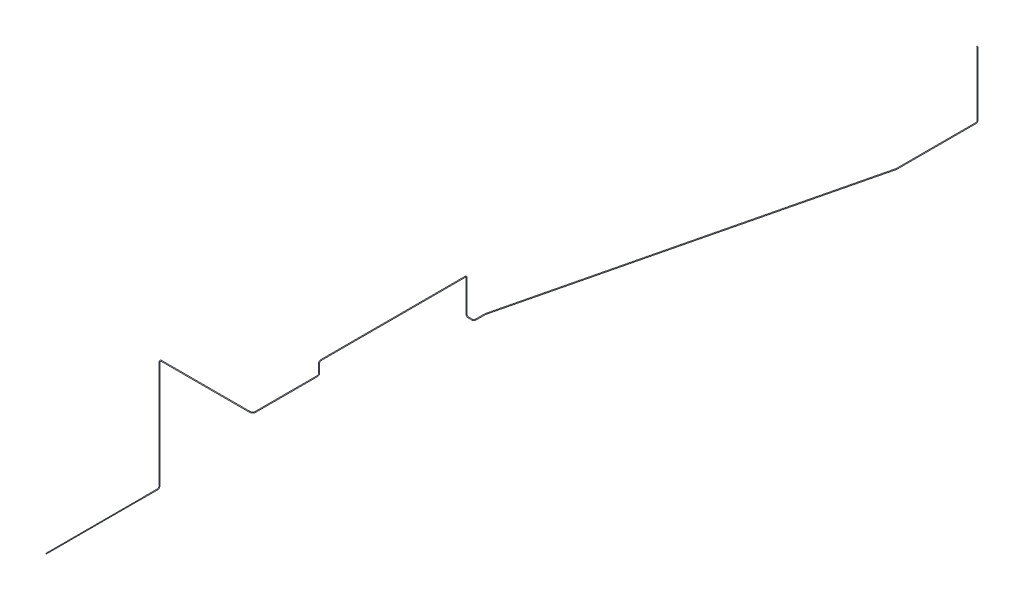
ISO-10303-21;
HEADER;
FILE_DESCRIPTION(('STEP AP214'),'2;1');
FILE_NAME('part.step','',(''),(''),'','','');
FILE_SCHEMA(('AUTOMOTIVE_DESIGN { 1 0 10303 214 1 1 1 1 }'));
ENDSEC;
DATA;
#1=APPLICATION_CONTEXT('core data for automotive mechanical design processes');
#2=APPLICATION_PROTOCOL_DEFINITION('international standard','automotive_design',2000,#1);
#3=PRODUCT_CONTEXT('',#1,'mechanical');
#4=PRODUCT('Part','Part','',(#3));
#5=PRODUCT_RELATED_PRODUCT_CATEGORY('part','',(#4));
#6=PRODUCT_DEFINITION_FORMATION('','',#4);
#7=PRODUCT_DEFINITION_CONTEXT('part definition',#1,'design');
#8=PRODUCT_DEFINITION('design','',#6,#7);
#9=PRODUCT_DEFINITION_SHAPE('','',#8);
#10=(LENGTH_UNIT() NAMED_UNIT(*) SI_UNIT(.MILLI.,.METRE.));
#11=(NAMED_UNIT(*) PLANE_ANGLE_UNIT() SI_UNIT($,.RADIAN.));
#12=(NAMED_UNIT(*) SI_UNIT($,.STERADIAN.) SOLID_ANGLE_UNIT());
#13=UNCERTAINTY_MEASURE_WITH_UNIT(LENGTH_MEASURE(1.E-05),#10,'distance_accuracy_value','');
#14=(GEOMETRIC_REPRESENTATION_CONTEXT(3) GLOBAL_UNCERTAINTY_ASSIGNED_CONTEXT((#13)) GLOBAL_UNIT_ASSIGNED_CONTEXT((#10,
#11,#12)) REPRESENTATION_CONTEXT('',''));
#15=CARTESIAN_POINT('',(0.,0.,0.));
#16=DIRECTION('',(0.,0.,1.));
#17=DIRECTION('',(1.,0.,0.));
#18=AXIS2_PLACEMENT_3D('',#15,#16,#17);
#19=CARTESIAN_POINT('',(0.,0.,-4000.));
#20=DIRECTION('',(0.,0.,1.));
#21=DIRECTION('',(1.,0.,0.));
#22=AXIS2_PLACEMENT_3D('',#19,#20,#21);
#23=CYLINDRICAL_SURFACE('',#22,12.7);
#24=CARTESIAN_POINT('',(0.,0.,-4000.));
#25=DIRECTION('',(0.,0.,-1.));
#26=DIRECTION('',(-1.,0.,0.));
#27=AXIS2_PLACEMENT_3D('',#24,#25,#26);
#28=CIRCLE('',#27,12.7);
#29=CARTESIAN_POINT('',(-12.7,0.,-4000.));
#30=VERTEX_POINT('',#29);
#31=EDGE_CURVE('E42',#30,#30,#28,.F.);
#32=ORIENTED_EDGE('',*,*,#31,.T.);
#33=EDGE_LOOP('',(#32));
#34=FACE_BOUND('',#33,.T.);
#35=CARTESIAN_POINT('',(0.,0.,0.));
#36=DIRECTION('',(0.,0.,1.));
#37=DIRECTION('',(1.,0.,0.));
#38=AXIS2_PLACEMENT_3D('',#35,#36,#37);
#39=CIRCLE('',#38,12.7);
#40=CARTESIAN_POINT('',(12.7,0.,0.));
#41=VERTEX_POINT('',#40);
#42=EDGE_CURVE('E11',#41,#41,#39,.T.);
#43=ORIENTED_EDGE('',*,*,#42,.F.);
#44=EDGE_LOOP('',(#43));
#45=FACE_BOUND('',#44,.T.);
#46=ADVANCED_FACE('F35',(#34,#45),#23,.T.);
#47=CARTESIAN_POINT('',(0.,0.,0.));
#48=DIRECTION('',(0.,0.,1.));
#49=DIRECTION('',(1.,0.,0.));
#50=AXIS2_PLACEMENT_3D('',#47,#48,#49);
#51=PLANE('',#50);
#52=ORIENTED_EDGE('',*,*,#42,.T.);
#53=EDGE_LOOP('',(#52));
#54=FACE_BOUND('',#53,.T.);
#55=ADVANCED_FACE('F146',(#54),#51,.T.);
#56=CARTESIAN_POINT('',(0.,0.,-4000.));
#57=DIRECTION('',(0.,0.,-1.));
#58=DIRECTION('',(-1.,0.,0.));
#59=AXIS2_PLACEMENT_3D('',#56,#57,#58);
#60=PLANE('',#59);
#61=ORIENTED_EDGE('',*,*,#31,.F.);
#62=EDGE_LOOP('',(#61));
#63=FACE_BOUND('',#62,.T.);
#64=CARTESIAN_POINT('',(0.,0.,-4000.));
#65=DIRECTION('',(0.,0.,-1.));
#66=DIRECTION('',(-1.,0.,0.));
#67=AXIS2_PLACEMENT_3D('',#64,#65,#66);
#68=CIRCLE('',#67,16.);
#69=CARTESIAN_POINT('',(-16.,0.,-4000.));
#70=VERTEX_POINT('',#69);
#71=EDGE_CURVE('E47',#70,#70,#68,.T.);
#72=ORIENTED_EDGE('',*,*,#71,.F.);
#73=EDGE_LOOP('',(#72));
#74=FACE_BOUND('',#73,.T.);
#75=ADVANCED_FACE('F142',(#63,#74),#60,.F.);
#76=CARTESIAN_POINT('',(4130.,3045.53474465878,-34350.));
#77=DIRECTION('',(-1.,0.,0.));
#78=DIRECTION('',(0.,-1.,0.));
#79=AXIS2_PLACEMENT_3D('',#76,#77,#78);
#80=PLANE('',#79);
#81=CARTESIAN_POINT('',(4130.,3045.53474465878,-34350.));
#82=DIRECTION('',(-1.,0.,0.));
#83=DIRECTION('',(0.,-1.,0.));
#84=AXIS2_PLACEMENT_3D('',#81,#82,#83);
#85=CIRCLE('',#84,16.);
#86=CARTESIAN_POINT('',(4130.,3029.53474465878,-34350.));
#87=VERTEX_POINT('',#86);
#88=EDGE_CURVE('E51',#87,#87,#85,.T.);
#89=ORIENTED_EDGE('',*,*,#88,.T.);
#90=EDGE_LOOP('',(#89));
#91=FACE_BOUND('',#90,.T.);
#92=ADVANCED_FACE('F52',(#91),#80,.T.);
#93=CARTESIAN_POINT('',(0.,0.,-4000.));
#94=DIRECTION('',(0.,0.,-1.));
#95=DIRECTION('',(-1.,0.,0.));
#96=AXIS2_PLACEMENT_3D('',#93,#94,#95);
#97=CYLINDRICAL_SURFACE('',#96,16.);
#98=CARTESIAN_POINT('',(0.,0.,-4590.));
#99=DIRECTION('',(0.,0.,-1.));
#100=DIRECTION('',(-1.,0.,0.));
#101=AXIS2_PLACEMENT_3D('',#98,#99,#100);
#102=CIRCLE('',#101,16.);
#103=CARTESIAN_POINT('',(0.,-15.9999999999604,-4590.));
#104=VERTEX_POINT('',#103);
#105=EDGE_CURVE('E126',#104,#104,#102,.T.);
#106=ORIENTED_EDGE('',*,*,#105,.F.);
#107=EDGE_LOOP('',(#106));
#108=FACE_BOUND('',#107,.T.);
#109=ORIENTED_EDGE('',*,*,#71,.T.);
#110=EDGE_LOOP('',(#109));
#111=FACE_BOUND('',#110,.T.);
#112=ADVANCED_FACE('F130',(#108,#111),#97,.T.);
#113=CARTESIAN_POINT('',(0.,90.,-4590.));
#114=DIRECTION('',(1.,0.,0.));
#115=DIRECTION('',(0.,0.,-1.));
#116=AXIS2_PLACEMENT_3D('',#113,#114,#115);
#117=TOROIDAL_SURFACE('',#116,89.9999999999605,16.);
#118=CARTESIAN_POINT('',(0.,89.9999999999999,-4680.));
#119=DIRECTION('',(0.,1.,0.));
#120=DIRECTION('',(-1.,0.,0.));
#121=AXIS2_PLACEMENT_3D('',#118,#119,#120);
#122=CIRCLE('',#121,16.);
#123=CARTESIAN_POINT('',(0.,89.9999999999998,-4695.99999999996));
#124=VERTEX_POINT('',#123);
#125=EDGE_CURVE('E123',#124,#124,#122,.T.);
#126=CARTESIAN_POINT('',(0.,90.,-4590.));
#127=DIRECTION('',(1.,0.,0.));
#128=DIRECTION('',(0.,0.,-1.));
#129=AXIS2_PLACEMENT_3D('',#126,#127,#128);
#130=CIRCLE('',#129,105.99999999996);
#131=EDGE_CURVE('',#104,#124,#130,.T.);
#132=ORIENTED_EDGE('',*,*,#105,.T.);
#133=ORIENTED_EDGE('',*,*,#125,.F.);
#134=ORIENTED_EDGE('',*,*,#131,.T.);
#135=ORIENTED_EDGE('',*,*,#131,.F.);
#136=EDGE_LOOP('',(#132,#134,#133,#135));
#137=FACE_BOUND('',#136,.T.);
#138=ADVANCED_FACE('F132',(#137),#117,.T.);
#139=CARTESIAN_POINT('',(0.,89.9999999999999,-4680.));
#140=DIRECTION('',(0.,1.,0.));
#141=DIRECTION('',(0.,0.,1.));
#142=AXIS2_PLACEMENT_3D('',#139,#140,#141);
#143=CYLINDRICAL_SURFACE('',#142,16.);
#144=CARTESIAN_POINT('',(0.,4510.,-4680.));
#145=DIRECTION('',(0.,1.,0.));
#146=DIRECTION('',(-1.,0.,0.));
#147=AXIS2_PLACEMENT_3D('',#144,#145,#146);
#148=CIRCLE('',#147,16.);
#149=CARTESIAN_POINT('',(-15.9999999999999,4510.,-4680.));
#150=VERTEX_POINT('',#149);
#151=EDGE_CURVE('E120',#150,#150,#148,.T.);
#152=ORIENTED_EDGE('',*,*,#151,.F.);
#153=EDGE_LOOP('',(#152));
#154=FACE_BOUND('',#153,.T.);
#155=ORIENTED_EDGE('',*,*,#125,.T.);
#156=EDGE_LOOP('',(#155));
#157=FACE_BOUND('',#156,.T.);
#158=ADVANCED_FACE('F139',(#154,#157),#143,.T.);
#159=CARTESIAN_POINT('',(90.,4510.,-4680.));
#160=DIRECTION('',(0.,0.,-1.));
#161=DIRECTION('',(-1.,0.,0.));
#162=AXIS2_PLACEMENT_3D('',#159,#160,#161);
#163=TOROIDAL_SURFACE('',#162,89.9999999999999,16.);
#164=CARTESIAN_POINT('',(89.9999999999999,4600.,-4680.));
#165=DIRECTION('',(1.,0.,0.));
#166=DIRECTION('',(0.,1.,0.));
#167=AXIS2_PLACEMENT_3D('',#164,#165,#166);
#168=CIRCLE('',#167,16.);
#169=CARTESIAN_POINT('',(89.9999999999998,4616.,-4680.));
#170=VERTEX_POINT('',#169);
#171=EDGE_CURVE('E117',#170,#170,#168,.T.);
#172=CARTESIAN_POINT('',(90.,4510.,-4680.));
#173=DIRECTION('',(0.,0.,-1.));
#174=DIRECTION('',(-1.,0.,0.));
#175=AXIS2_PLACEMENT_3D('',#172,#173,#174);
#176=CIRCLE('',#175,106.);
#177=EDGE_CURVE('',#150,#170,#176,.T.);
#178=ORIENTED_EDGE('',*,*,#151,.T.);
#179=ORIENTED_EDGE('',*,*,#171,.F.);
#180=ORIENTED_EDGE('',*,*,#177,.T.);
#181=ORIENTED_EDGE('',*,*,#177,.F.);
#182=EDGE_LOOP('',(#178,#180,#179,#181));
#183=FACE_BOUND('',#182,.T.);
#184=ADVANCED_FACE('F243',(#183),#163,.T.);
#185=CARTESIAN_POINT('',(89.9999999999999,4600.,-4680.));
#186=DIRECTION('',(1.,0.,0.));
#187=DIRECTION('',(0.,0.,-1.));
#188=AXIS2_PLACEMENT_3D('',#185,#186,#187);
#189=CYLINDRICAL_SURFACE('',#188,16.);
#190=CARTESIAN_POINT('',(3730.,4600.,-4680.));
#191=DIRECTION('',(1.,0.,0.));
#192=DIRECTION('',(0.,1.,0.));
#193=AXIS2_PLACEMENT_3D('',#190,#191,#192);
#194=CIRCLE('',#193,16.);
#195=CARTESIAN_POINT('',(3730.,4600.,-4664.));
#196=VERTEX_POINT('',#195);
#197=EDGE_CURVE('E114',#196,#196,#194,.T.);
#198=ORIENTED_EDGE('',*,*,#197,.F.);
#199=EDGE_LOOP('',(#198));
#200=FACE_BOUND('',#199,.T.);
#201=ORIENTED_EDGE('',*,*,#171,.T.);
#202=EDGE_LOOP('',(#201));
#203=FACE_BOUND('',#202,.T.);
#204=ADVANCED_FACE('F239',(#200,#203),#189,.T.);
#205=CARTESIAN_POINT('',(3730.,4600.,-4800.));
#206=DIRECTION('',(0.,1.,0.));
#207=DIRECTION('',(0.,0.,1.));
#208=AXIS2_PLACEMENT_3D('',#205,#206,#207);
#209=TOROIDAL_SURFACE('',#208,120.,16.);
#210=CARTESIAN_POINT('',(3850.,4600.,-4800.));
#211=DIRECTION('',(0.,0.,-1.));
#212=DIRECTION('',(0.,1.,0.));
#213=AXIS2_PLACEMENT_3D('',#210,#211,#212);
#214=CIRCLE('',#213,16.);
#215=CARTESIAN_POINT('',(3866.,4600.,-4800.));
#216=VERTEX_POINT('',#215);
#217=EDGE_CURVE('E111',#216,#216,#214,.T.);
#218=CARTESIAN_POINT('',(3730.,4600.,-4800.));
#219=DIRECTION('',(0.,1.,0.));
#220=DIRECTION('',(0.,0.,1.));
#221=AXIS2_PLACEMENT_3D('',#218,#219,#220);
#222=CIRCLE('',#221,136.);
#223=EDGE_CURVE('',#196,#216,#222,.T.);
#224=ORIENTED_EDGE('',*,*,#197,.T.);
#225=ORIENTED_EDGE('',*,*,#217,.F.);
#226=ORIENTED_EDGE('',*,*,#223,.T.);
#227=ORIENTED_EDGE('',*,*,#223,.F.);
#228=EDGE_LOOP('',(#224,#226,#225,#227));
#229=FACE_BOUND('',#228,.T.);
#230=ADVANCED_FACE('F235',(#229),#209,.T.);
#231=CARTESIAN_POINT('',(3850.,4600.,-4800.));
#232=DIRECTION('',(0.,0.,-1.));
#233=DIRECTION('',(-1.,0.,0.));
#234=AXIS2_PLACEMENT_3D('',#231,#232,#233);
#235=CYLINDRICAL_SURFACE('',#234,16.);
#236=CARTESIAN_POINT('',(3850.,4600.,-7370.));
#237=DIRECTION('',(0.,0.,-1.));
#238=DIRECTION('',(0.,1.,0.));
#239=AXIS2_PLACEMENT_3D('',#236,#237,#238);
#240=CIRCLE('',#239,16.);
#241=CARTESIAN_POINT('',(3850.,4584.,-7370.));
#242=VERTEX_POINT('',#241);
#243=EDGE_CURVE('E108',#242,#242,#240,.T.);
#244=ORIENTED_EDGE('',*,*,#243,.F.);
#245=EDGE_LOOP('',(#244));
#246=FACE_BOUND('',#245,.T.);
#247=ORIENTED_EDGE('',*,*,#217,.T.);
#248=EDGE_LOOP('',(#247));
#249=FACE_BOUND('',#248,.T.);
#250=ADVANCED_FACE('F231',(#246,#249),#235,.T.);
#251=CARTESIAN_POINT('',(3850.,4660.,-7370.));
#252=DIRECTION('',(1.,0.,0.));
#253=DIRECTION('',(0.,0.,-1.));
#254=AXIS2_PLACEMENT_3D('',#251,#252,#253);
#255=TOROIDAL_SURFACE('',#254,59.9999999999996,16.);
#256=CARTESIAN_POINT('',(3850.,4660.,-7430.));
#257=DIRECTION('',(0.,1.,0.));
#258=DIRECTION('',(0.,0.,1.));
#259=AXIS2_PLACEMENT_3D('',#256,#257,#258);
#260=CIRCLE('',#259,16.);
#261=CARTESIAN_POINT('',(3850.,4660.,-7446.));
#262=VERTEX_POINT('',#261);
#263=EDGE_CURVE('E105',#262,#262,#260,.T.);
#264=CARTESIAN_POINT('',(3850.,4660.,-7370.));
#265=DIRECTION('',(1.,0.,0.));
#266=DIRECTION('',(0.,0.,-1.));
#267=AXIS2_PLACEMENT_3D('',#264,#265,#266);
#268=CIRCLE('',#267,75.9999999999996);
#269=EDGE_CURVE('',#242,#262,#268,.T.);
#270=ORIENTED_EDGE('',*,*,#243,.T.);
#271=ORIENTED_EDGE('',*,*,#263,.F.);
#272=ORIENTED_EDGE('',*,*,#269,.T.);
#273=ORIENTED_EDGE('',*,*,#269,.F.);
#274=EDGE_LOOP('',(#270,#272,#271,#273));
#275=FACE_BOUND('',#274,.T.);
#276=ADVANCED_FACE('F227',(#275),#255,.T.);
#277=CARTESIAN_POINT('',(3850.,4660.,-7430.));
#278=DIRECTION('',(0.,1.,0.));
#279=DIRECTION('',(0.,0.,1.));
#280=AXIS2_PLACEMENT_3D('',#277,#278,#279);
#281=CYLINDRICAL_SURFACE('',#280,16.);
#282=CARTESIAN_POINT('',(3850.,5040.,-7430.));
#283=DIRECTION('',(0.,1.,0.));
#284=DIRECTION('',(0.,0.,1.));
#285=AXIS2_PLACEMENT_3D('',#282,#283,#284);
#286=CIRCLE('',#285,16.);
#287=CARTESIAN_POINT('',(3850.,5040.,-7414.));
#288=VERTEX_POINT('',#287);
#289=EDGE_CURVE('E102',#288,#288,#286,.T.);
#290=ORIENTED_EDGE('',*,*,#289,.F.);
#291=EDGE_LOOP('',(#290));
#292=FACE_BOUND('',#291,.T.);
#293=ORIENTED_EDGE('',*,*,#263,.T.);
#294=EDGE_LOOP('',(#293));
#295=FACE_BOUND('',#294,.T.);
#296=ADVANCED_FACE('F223',(#292,#295),#281,.T.);
#297=CARTESIAN_POINT('',(3850.,5040.,-7490.));
#298=DIRECTION('',(-1.,0.,0.));
#299=DIRECTION('',(0.,0.,1.));
#300=AXIS2_PLACEMENT_3D('',#297,#298,#299);
#301=TOROIDAL_SURFACE('',#300,59.9999999999996,16.);
#302=CARTESIAN_POINT('',(3850.,5100.,-7490.));
#303=DIRECTION('',(0.,0.,-1.));
#304=DIRECTION('',(0.,1.,0.));
#305=AXIS2_PLACEMENT_3D('',#302,#303,#304);
#306=CIRCLE('',#305,16.);
#307=CARTESIAN_POINT('',(3850.,5116.,-7490.));
#308=VERTEX_POINT('',#307);
#309=EDGE_CURVE('E99',#308,#308,#306,.T.);
#310=CARTESIAN_POINT('',(3850.,5040.,-7490.));
#311=DIRECTION('',(-1.,0.,0.));
#312=DIRECTION('',(0.,0.,1.));
#313=AXIS2_PLACEMENT_3D('',#310,#311,#312);
#314=CIRCLE('',#313,75.9999999999996);
#315=EDGE_CURVE('',#288,#308,#314,.T.);
#316=ORIENTED_EDGE('',*,*,#289,.T.);
#317=ORIENTED_EDGE('',*,*,#309,.F.);
#318=ORIENTED_EDGE('',*,*,#315,.T.);
#319=ORIENTED_EDGE('',*,*,#315,.F.);
#320=EDGE_LOOP('',(#316,#318,#317,#319));
#321=FACE_BOUND('',#320,.T.);
#322=ADVANCED_FACE('F219',(#321),#301,.T.);
#323=CARTESIAN_POINT('',(3850.,5100.,-7490.));
#324=DIRECTION('',(0.,0.,-1.));
#325=DIRECTION('',(-1.,0.,0.));
#326=AXIS2_PLACEMENT_3D('',#323,#324,#325);
#327=CYLINDRICAL_SURFACE('',#326,16.);
#328=CARTESIAN_POINT('',(3850.,5100.,-13470.));
#329=DIRECTION('',(0.,0.,-1.));
#330=DIRECTION('',(0.,1.,0.));
#331=AXIS2_PLACEMENT_3D('',#328,#329,#330);
#332=CIRCLE('',#331,16.);
#333=CARTESIAN_POINT('',(3850.,5116.,-13470.));
#334=VERTEX_POINT('',#333);
#335=EDGE_CURVE('E96',#334,#334,#332,.T.);
#336=ORIENTED_EDGE('',*,*,#335,.F.);
#337=EDGE_LOOP('',(#336));
#338=FACE_BOUND('',#337,.T.);
#339=ORIENTED_EDGE('',*,*,#309,.T.);
#340=EDGE_LOOP('',(#339));
#341=FACE_BOUND('',#340,.T.);
#342=ADVANCED_FACE('F215',(#338,#341),#327,.T.);
#343=CARTESIAN_POINT('',(3850.,5040.,-13470.));
#344=DIRECTION('',(-1.,0.,0.));
#345=DIRECTION('',(0.,0.,1.));
#346=AXIS2_PLACEMENT_3D('',#343,#344,#345);
#347=TOROIDAL_SURFACE('',#346,59.9999999999996,16.);
#348=CARTESIAN_POINT('',(3850.,5040.,-13530.));
#349=DIRECTION('',(0.,-1.,0.));
#350=DIRECTION('',(0.,0.,-1.));
#351=AXIS2_PLACEMENT_3D('',#348,#349,#350);
#352=CIRCLE('',#351,16.);
#353=CARTESIAN_POINT('',(3850.,5040.,-13546.));
#354=VERTEX_POINT('',#353);
#355=EDGE_CURVE('E93',#354,#354,#352,.T.);
#356=CARTESIAN_POINT('',(3850.,5040.,-13470.));
#357=DIRECTION('',(-1.,0.,0.));
#358=DIRECTION('',(0.,0.,1.));
#359=AXIS2_PLACEMENT_3D('',#356,#357,#358);
#360=CIRCLE('',#359,75.9999999999996);
#361=EDGE_CURVE('',#334,#354,#360,.T.);
#362=ORIENTED_EDGE('',*,*,#335,.T.);
#363=ORIENTED_EDGE('',*,*,#355,.F.);
#364=ORIENTED_EDGE('',*,*,#361,.T.);
#365=ORIENTED_EDGE('',*,*,#361,.F.);
#366=EDGE_LOOP('',(#362,#364,#363,#365));
#367=FACE_BOUND('',#366,.T.);
#368=ADVANCED_FACE('F211',(#367),#347,.T.);
#369=CARTESIAN_POINT('',(3850.,5040.,-13530.));
#370=DIRECTION('',(0.,-1.,0.));
#371=DIRECTION('',(0.,0.,-1.));
#372=AXIS2_PLACEMENT_3D('',#369,#370,#371);
#373=CYLINDRICAL_SURFACE('',#372,16.);
#374=CARTESIAN_POINT('',(3850.,3710.,-13530.));
#375=DIRECTION('',(0.,-1.,0.));
#376=DIRECTION('',(0.,0.,-1.));
#377=AXIS2_PLACEMENT_3D('',#374,#375,#376);
#378=CIRCLE('',#377,16.);
#379=CARTESIAN_POINT('',(3834.,3710.,-13530.));
#380=VERTEX_POINT('',#379);
#381=EDGE_CURVE('E90',#380,#380,#378,.T.);
#382=ORIENTED_EDGE('',*,*,#381,.F.);
#383=EDGE_LOOP('',(#382));
#384=FACE_BOUND('',#383,.T.);
#385=ORIENTED_EDGE('',*,*,#355,.T.);
#386=EDGE_LOOP('',(#385));
#387=FACE_BOUND('',#386,.T.);
#388=ADVANCED_FACE('F207',(#384,#387),#373,.T.);
#389=CARTESIAN_POINT('',(3910.,3710.,-13530.));
#390=DIRECTION('',(0.,0.,1.));
#391=DIRECTION('',(1.,0.,0.));
#392=AXIS2_PLACEMENT_3D('',#389,#390,#391);
#393=TOROIDAL_SURFACE('',#392,60.0000000000001,16.);
#394=CARTESIAN_POINT('',(3910.,3650.,-13530.));
#395=DIRECTION('',(1.,0.,0.));
#396=DIRECTION('',(0.,0.,-1.));
#397=AXIS2_PLACEMENT_3D('',#394,#395,#396);
#398=CIRCLE('',#397,16.);
#399=CARTESIAN_POINT('',(3910.,3634.,-13530.));
#400=VERTEX_POINT('',#399);
#401=EDGE_CURVE('E87',#400,#400,#398,.T.);
#402=CARTESIAN_POINT('',(3910.,3710.,-13530.));
#403=DIRECTION('',(0.,0.,1.));
#404=DIRECTION('',(1.,0.,0.));
#405=AXIS2_PLACEMENT_3D('',#402,#403,#404);
#406=CIRCLE('',#405,76.0000000000001);
#407=EDGE_CURVE('',#380,#400,#406,.T.);
#408=ORIENTED_EDGE('',*,*,#381,.T.);
#409=ORIENTED_EDGE('',*,*,#401,.F.);
#410=ORIENTED_EDGE('',*,*,#407,.T.);
#411=ORIENTED_EDGE('',*,*,#407,.F.);
#412=EDGE_LOOP('',(#408,#410,#409,#411));
#413=FACE_BOUND('',#412,.T.);
#414=ADVANCED_FACE('F203',(#413),#393,.T.);
#415=CARTESIAN_POINT('',(3910.,3650.,-13530.));
#416=DIRECTION('',(1.,0.,0.));
#417=DIRECTION('',(0.,0.,-1.));
#418=AXIS2_PLACEMENT_3D('',#415,#416,#417);
#419=CYLINDRICAL_SURFACE('',#418,16.);
#420=CARTESIAN_POINT('',(4090.,3650.,-13530.));
#421=DIRECTION('',(1.,0.,0.));
#422=DIRECTION('',(0.,0.,-1.));
#423=AXIS2_PLACEMENT_3D('',#420,#421,#422);
#424=CIRCLE('',#423,16.);
#425=CARTESIAN_POINT('',(4090.,3650.,-13514.));
#426=VERTEX_POINT('',#425);
#427=EDGE_CURVE('E84',#426,#426,#424,.T.);
#428=ORIENTED_EDGE('',*,*,#427,.F.);
#429=EDGE_LOOP('',(#428));
#430=FACE_BOUND('',#429,.T.);
#431=ORIENTED_EDGE('',*,*,#401,.T.);
#432=EDGE_LOOP('',(#431));
#433=FACE_BOUND('',#432,.T.);
#434=ADVANCED_FACE('F199',(#430,#433),#419,.T.);
#435=CARTESIAN_POINT('',(4090.,3650.,-13590.));
#436=DIRECTION('',(0.,1.,0.));
#437=DIRECTION('',(0.,0.,1.));
#438=AXIS2_PLACEMENT_3D('',#435,#436,#437);
#439=TOROIDAL_SURFACE('',#438,60.0000000000005,16.);
#440=CARTESIAN_POINT('',(4150.,3650.,-13590.));
#441=DIRECTION('',(0.,0.,-1.));
#442=DIRECTION('',(-1.,0.,0.));
#443=AXIS2_PLACEMENT_3D('',#440,#441,#442);
#444=CIRCLE('',#443,16.);
#445=CARTESIAN_POINT('',(4166.,3650.,-13590.));
#446=VERTEX_POINT('',#445);
#447=EDGE_CURVE('E81',#446,#446,#444,.T.);
#448=CARTESIAN_POINT('',(4090.,3650.,-13590.));
#449=DIRECTION('',(0.,1.,0.));
#450=DIRECTION('',(0.,0.,1.));
#451=AXIS2_PLACEMENT_3D('',#448,#449,#450);
#452=CIRCLE('',#451,76.0000000000005);
#453=EDGE_CURVE('',#426,#446,#452,.T.);
#454=ORIENTED_EDGE('',*,*,#427,.T.);
#455=ORIENTED_EDGE('',*,*,#447,.F.);
#456=ORIENTED_EDGE('',*,*,#453,.T.);
#457=ORIENTED_EDGE('',*,*,#453,.F.);
#458=EDGE_LOOP('',(#454,#456,#455,#457));
#459=FACE_BOUND('',#458,.T.);
#460=ADVANCED_FACE('F195',(#459),#439,.T.);
#461=CARTESIAN_POINT('',(4150.,3650.,-13590.));
#462=DIRECTION('',(0.,0.,-1.));
#463=DIRECTION('',(-1.,0.,0.));
#464=AXIS2_PLACEMENT_3D('',#461,#462,#463);
#465=CYLINDRICAL_SURFACE('',#464,16.);
#466=CARTESIAN_POINT('',(4150.,3650.,-13994.2226571081));
#467=DIRECTION('',(0.,0.,-1.));
#468=DIRECTION('',(-1.,0.,0.));
#469=AXIS2_PLACEMENT_3D('',#466,#467,#468);
#470=CIRCLE('',#469,16.);
#471=CARTESIAN_POINT('',(4150.,3666.,-13994.2226571081));
#472=VERTEX_POINT('',#471);
#473=EDGE_CURVE('E78',#472,#472,#470,.T.);
#474=ORIENTED_EDGE('',*,*,#473,.F.);
#475=EDGE_LOOP('',(#474));
#476=FACE_BOUND('',#475,.T.);
#477=ORIENTED_EDGE('',*,*,#447,.T.);
#478=EDGE_LOOP('',(#477));
#479=FACE_BOUND('',#478,.T.);
#480=ADVANCED_FACE('F191',(#476,#479),#465,.T.);
#481=CARTESIAN_POINT('',(4150.,3590.,-13994.2226571081));
#482=DIRECTION('',(-1.,0.,0.));
#483=DIRECTION('',(0.,0.,1.));
#484=AXIS2_PLACEMENT_3D('',#481,#482,#483);
#485=TOROIDAL_SURFACE('',#484,59.9999999999996,16.);
#486=CARTESIAN_POINT('',(4150.,3648.89763100686,-14005.6711968307));
#487=DIRECTION('',(0.,-0.190808995376558,-0.981627183447661));
#488=DIRECTION('',(-1.,0.,0.));
#489=AXIS2_PLACEMENT_3D('',#486,#487,#488);
#490=CIRCLE('',#489,16.);
#491=CARTESIAN_POINT('',(4150.,3664.60366594202,-14008.7241407568));
#492=VERTEX_POINT('',#491);
#493=EDGE_CURVE('E75',#492,#492,#490,.T.);
#494=CARTESIAN_POINT('',(4150.,3590.,-13994.2226571081));
#495=DIRECTION('',(-1.,0.,0.));
#496=DIRECTION('',(0.,0.,1.));
#497=AXIS2_PLACEMENT_3D('',#494,#495,#496);
#498=CIRCLE('',#497,75.9999999999996);
#499=EDGE_CURVE('',#472,#492,#498,.T.);
#500=ORIENTED_EDGE('',*,*,#473,.T.);
#501=ORIENTED_EDGE('',*,*,#493,.F.);
#502=ORIENTED_EDGE('',*,*,#499,.T.);
#503=ORIENTED_EDGE('',*,*,#499,.F.);
#504=EDGE_LOOP('',(#500,#502,#501,#503));
#505=FACE_BOUND('',#504,.T.);
#506=ADVANCED_FACE('F187',(#505),#485,.T.);
#507=CARTESIAN_POINT('',(4150.,3648.89763100686,-14005.6711968307));
#508=DIRECTION('',(0.,-0.190808995376545,-0.981627183447664));
#509=DIRECTION('',(0.,0.981627183447664,-0.190808995376545));
#510=AXIS2_PLACEMENT_3D('',#507,#508,#509);
#511=CYLINDRICAL_SURFACE('',#510,16.);
#512=CARTESIAN_POINT('',(4150.,346.637113651918,-30994.3288031693));
#513=DIRECTION('',(0.,-0.190808995376545,-0.981627183447664));
#514=DIRECTION('',(-1.,0.,0.));
#515=AXIS2_PLACEMENT_3D('',#512,#513,#514);
#516=CIRCLE('',#515,16.);
#517=CARTESIAN_POINT('',(4150.,330.931078716755,-30991.2758592432));
#518=VERTEX_POINT('',#517);
#519=EDGE_CURVE('E72',#518,#518,#516,.T.);
#520=ORIENTED_EDGE('',*,*,#519,.F.);
#521=EDGE_LOOP('',(#520));
#522=FACE_BOUND('',#521,.T.);
#523=ORIENTED_EDGE('',*,*,#493,.T.);
#524=EDGE_LOOP('',(#523));
#525=FACE_BOUND('',#524,.T.);
#526=ADVANCED_FACE('F183',(#522,#525),#511,.T.);
#527=CARTESIAN_POINT('',(4150.,405.534744658777,-31005.7773428919));
#528=DIRECTION('',(1.,0.,0.));
#529=DIRECTION('',(0.,0.,-1.));
#530=AXIS2_PLACEMENT_3D('',#527,#528,#529);
#531=TOROIDAL_SURFACE('',#530,59.9999999999999,16.);
#532=CARTESIAN_POINT('',(4150.,345.534744658777,-31005.7773428919));
#533=DIRECTION('',(0.,0.,-1.));
#534=DIRECTION('',(-1.,0.,0.));
#535=AXIS2_PLACEMENT_3D('',#532,#533,#534);
#536=CIRCLE('',#535,16.);
#537=CARTESIAN_POINT('',(4150.,329.534744658777,-31005.7773428919));
#538=VERTEX_POINT('',#537);
#539=EDGE_CURVE('E69',#538,#538,#536,.T.);
#540=CARTESIAN_POINT('',(4150.,405.534744658777,-31005.7773428919));
#541=DIRECTION('',(1.,0.,0.));
#542=DIRECTION('',(0.,0.,-1.));
#543=AXIS2_PLACEMENT_3D('',#540,#541,#542);
#544=CIRCLE('',#543,75.9999999999999);
#545=EDGE_CURVE('',#518,#538,#544,.T.);
#546=ORIENTED_EDGE('',*,*,#519,.T.);
#547=ORIENTED_EDGE('',*,*,#539,.F.);
#548=ORIENTED_EDGE('',*,*,#545,.T.);
#549=ORIENTED_EDGE('',*,*,#545,.F.);
#550=EDGE_LOOP('',(#546,#548,#547,#549));
#551=FACE_BOUND('',#550,.T.);
#552=ADVANCED_FACE('F179',(#551),#531,.T.);
#553=CARTESIAN_POINT('',(4150.,345.534744658777,-31005.7773428919));
#554=DIRECTION('',(0.,0.,-1.));
#555=DIRECTION('',(-1.,0.,0.));
#556=AXIS2_PLACEMENT_3D('',#553,#554,#555);
#557=CYLINDRICAL_SURFACE('',#556,16.);
#558=CARTESIAN_POINT('',(4150.,345.534744658777,-34290.));
#559=DIRECTION('',(0.,0.,-1.));
#560=DIRECTION('',(-1.,0.,0.));
#561=AXIS2_PLACEMENT_3D('',#558,#559,#560);
#562=CIRCLE('',#561,16.);
#563=CARTESIAN_POINT('',(4150.,329.534744658776,-34290.));
#564=VERTEX_POINT('',#563);
#565=EDGE_CURVE('E66',#564,#564,#562,.T.);
#566=ORIENTED_EDGE('',*,*,#565,.F.);
#567=EDGE_LOOP('',(#566));
#568=FACE_BOUND('',#567,.T.);
#569=ORIENTED_EDGE('',*,*,#539,.T.);
#570=EDGE_LOOP('',(#569));
#571=FACE_BOUND('',#570,.T.);
#572=ADVANCED_FACE('F175',(#568,#571),#557,.T.);
#573=CARTESIAN_POINT('',(4150.,405.534744658777,-34290.));
#574=DIRECTION('',(1.,0.,0.));
#575=DIRECTION('',(0.,0.,-1.));
#576=AXIS2_PLACEMENT_3D('',#573,#574,#575);
#577=TOROIDAL_SURFACE('',#576,60.0000000000011,16.);
#578=CARTESIAN_POINT('',(4150.,405.534744658777,-34350.));
#579=DIRECTION('',(0.,1.,0.));
#580=DIRECTION('',(-1.,0.,0.));
#581=AXIS2_PLACEMENT_3D('',#578,#579,#580);
#582=CIRCLE('',#581,16.);
#583=CARTESIAN_POINT('',(4150.,405.534744658777,-34366.));
#584=VERTEX_POINT('',#583);
#585=EDGE_CURVE('E63',#584,#584,#582,.T.);
#586=CARTESIAN_POINT('',(4150.,405.534744658777,-34290.));
#587=DIRECTION('',(1.,0.,0.));
#588=DIRECTION('',(0.,0.,-1.));
#589=AXIS2_PLACEMENT_3D('',#586,#587,#588);
#590=CIRCLE('',#589,76.0000000000011);
#591=EDGE_CURVE('',#564,#584,#590,.T.);
#592=ORIENTED_EDGE('',*,*,#565,.T.);
#593=ORIENTED_EDGE('',*,*,#585,.F.);
#594=ORIENTED_EDGE('',*,*,#591,.T.);
#595=ORIENTED_EDGE('',*,*,#591,.F.);
#596=EDGE_LOOP('',(#592,#594,#593,#595));
#597=FACE_BOUND('',#596,.T.);
#598=ADVANCED_FACE('F171',(#597),#577,.T.);
#599=CARTESIAN_POINT('',(4150.,405.534744658777,-34350.));
#600=DIRECTION('',(0.,1.,0.));
#601=DIRECTION('',(0.,0.,1.));
#602=AXIS2_PLACEMENT_3D('',#599,#600,#601);
#603=CYLINDRICAL_SURFACE('',#602,16.);
#604=CARTESIAN_POINT('',(4150.,3028.53474465878,-34350.));
#605=DIRECTION('',(0.,1.,0.));
#606=DIRECTION('',(-1.,0.,0.));
#607=AXIS2_PLACEMENT_3D('',#604,#605,#606);
#608=CIRCLE('',#607,16.);
#609=CARTESIAN_POINT('',(4166.,3028.53474465878,-34350.));
#610=VERTEX_POINT('',#609);
#611=EDGE_CURVE('E58',#610,#610,#608,.T.);
#612=ORIENTED_EDGE('',*,*,#611,.F.);
#613=EDGE_LOOP('',(#612));
#614=FACE_BOUND('',#613,.T.);
#615=ORIENTED_EDGE('',*,*,#585,.T.);
#616=EDGE_LOOP('',(#615));
#617=FACE_BOUND('',#616,.T.);
#618=ADVANCED_FACE('F167',(#614,#617),#603,.T.);
#619=CARTESIAN_POINT('',(4133.,3028.53474465878,-34350.));
#620=DIRECTION('',(0.,0.,1.));
#621=DIRECTION('',(1.,0.,0.));
#622=AXIS2_PLACEMENT_3D('',#619,#620,#621);
#623=TOROIDAL_SURFACE('',#622,17.0000000000003,16.);
#624=CARTESIAN_POINT('',(4133.,3045.53474465878,-34350.));
#625=DIRECTION('',(-1.,0.,0.));
#626=DIRECTION('',(0.,-1.,0.));
#627=AXIS2_PLACEMENT_3D('',#624,#625,#626);
#628=CIRCLE('',#627,16.);
#629=CARTESIAN_POINT('',(4133.,3061.53474465878,-34350.));
#630=VERTEX_POINT('',#629);
#631=EDGE_CURVE('E54',#630,#630,#628,.T.);
#632=CARTESIAN_POINT('',(4133.,3028.53474465878,-34350.));
#633=DIRECTION('',(0.,0.,1.));
#634=DIRECTION('',(1.,0.,0.));
#635=AXIS2_PLACEMENT_3D('',#632,#633,#634);
#636=CIRCLE('',#635,33.0000000000003);
#637=EDGE_CURVE('',#610,#630,#636,.T.);
#638=ORIENTED_EDGE('',*,*,#611,.T.);
#639=ORIENTED_EDGE('',*,*,#631,.F.);
#640=ORIENTED_EDGE('',*,*,#637,.T.);
#641=ORIENTED_EDGE('',*,*,#637,.F.);
#642=EDGE_LOOP('',(#638,#640,#639,#641));
#643=FACE_BOUND('',#642,.T.);
#644=ADVANCED_FACE('F164',(#643),#623,.T.);
#645=CARTESIAN_POINT('',(4133.,3045.53474465878,-34350.));
#646=DIRECTION('',(-1.,0.,0.));
#647=DIRECTION('',(0.,0.,1.));
#648=AXIS2_PLACEMENT_3D('',#645,#646,#647);
#649=CYLINDRICAL_SURFACE('',#648,16.);
#650=ORIENTED_EDGE('',*,*,#88,.F.);
#651=EDGE_LOOP('',(#650));
#652=FACE_BOUND('',#651,.T.);
#653=ORIENTED_EDGE('',*,*,#631,.T.);
#654=EDGE_LOOP('',(#653));
#655=FACE_BOUND('',#654,.T.);
#656=ADVANCED_FACE('F152',(#652,#655),#649,.T.);
#657=CLOSED_SHELL('',(#46,#55,#75,#92,#112,#138,#158,#184,#204,#230,#250,#276,#296,#322,#342,
#368,#388,#414,#434,#460,#480,#506,#526,#552,#572,#598,#618,#644,#656));
#658=MANIFOLD_SOLID_BREP('B2',#657);
#659=ADVANCED_BREP_SHAPE_REPRESENTATION('',(#18,#658),#14);
#660=SHAPE_DEFINITION_REPRESENTATION(#9,#659);
ENDSEC;
END-ISO-10303-21;
